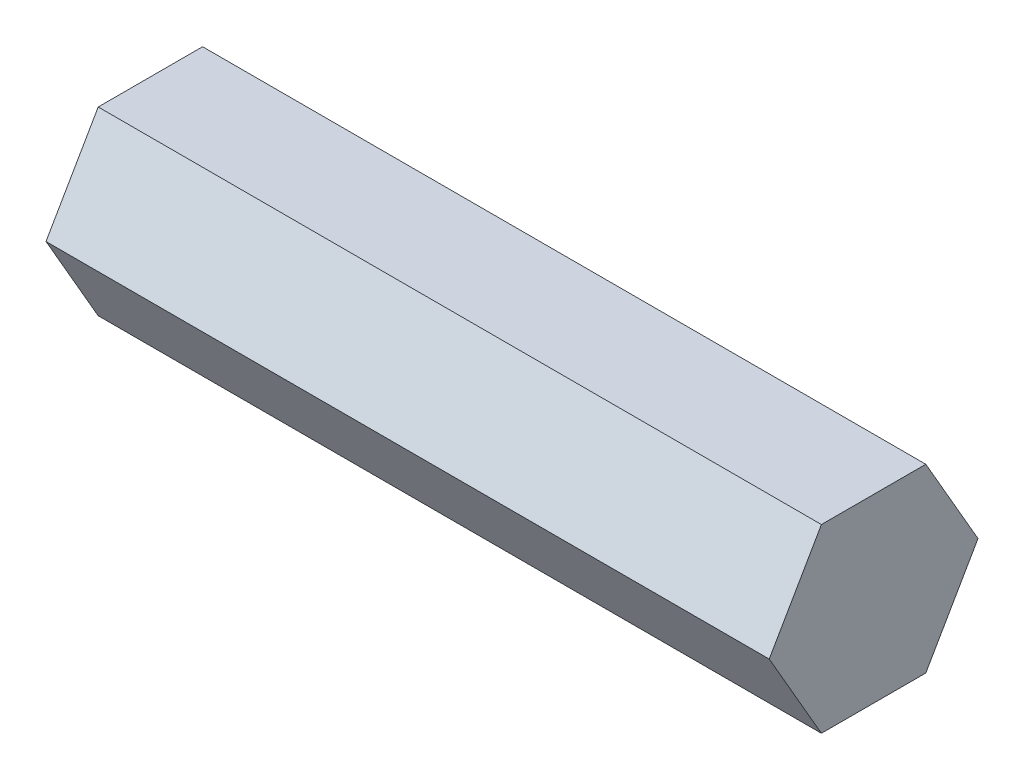
ISO-10303-21;
HEADER;
FILE_DESCRIPTION(('STEP AP214'),'2;1');
FILE_NAME('part.step','',(''),(''),'','','');
FILE_SCHEMA(('AUTOMOTIVE_DESIGN { 1 0 10303 214 1 1 1 1 }'));
ENDSEC;
DATA;
#1=APPLICATION_CONTEXT('core data for automotive mechanical design processes');
#2=APPLICATION_PROTOCOL_DEFINITION('international standard','automotive_design',2000,#1);
#3=PRODUCT_CONTEXT('',#1,'mechanical');
#4=PRODUCT('Part','Part','',(#3));
#5=PRODUCT_RELATED_PRODUCT_CATEGORY('part','',(#4));
#6=PRODUCT_DEFINITION_FORMATION('','',#4);
#7=PRODUCT_DEFINITION_CONTEXT('part definition',#1,'design');
#8=PRODUCT_DEFINITION('design','',#6,#7);
#9=PRODUCT_DEFINITION_SHAPE('','',#8);
#10=(LENGTH_UNIT() NAMED_UNIT(*) SI_UNIT(.MILLI.,.METRE.));
#11=(NAMED_UNIT(*) PLANE_ANGLE_UNIT() SI_UNIT($,.RADIAN.));
#12=(NAMED_UNIT(*) SI_UNIT($,.STERADIAN.) SOLID_ANGLE_UNIT());
#13=UNCERTAINTY_MEASURE_WITH_UNIT(LENGTH_MEASURE(1.E-05),#10,'distance_accuracy_value','');
#14=(GEOMETRIC_REPRESENTATION_CONTEXT(3) GLOBAL_UNCERTAINTY_ASSIGNED_CONTEXT((#13)) GLOBAL_UNIT_ASSIGNED_CONTEXT((#10,
#11,#12)) REPRESENTATION_CONTEXT('',''));
#15=CARTESIAN_POINT('',(0.,0.,0.));
#16=DIRECTION('',(0.,0.,1.));
#17=DIRECTION('',(1.,0.,0.));
#18=AXIS2_PLACEMENT_3D('',#15,#16,#17);
#19=CARTESIAN_POINT('',(25.4,-6.34999999999996,-3.6661742093542));
#20=DIRECTION('',(0.,0.499999999999995,0.866025403784441));
#21=DIRECTION('',(0.,-0.866025403784441,0.499999999999995));
#22=AXIS2_PLACEMENT_3D('',#19,#20,#21);
#23=PLANE('',#22);
#24=DIRECTION('',(0.,0.866025403784441,-0.499999999999995));
#25=VECTOR('',#24,1.);
#26=CARTESIAN_POINT('',(-25.4,-6.34999999999996,-3.6661742093542));
#27=LINE('',#26,#25);
#28=CARTESIAN_POINT('',(-25.4,-6.34999999999996,-3.6661742093542));
#29=VERTEX_POINT('',#28);
#30=CARTESIAN_POINT('',(-25.4,0.,-7.33234841870825));
#31=VERTEX_POINT('',#30);
#32=EDGE_CURVE('E153',#29,#31,#27,.T.);
#33=ORIENTED_EDGE('',*,*,#32,.T.);
#34=DIRECTION('',(-1.,0.,0.));
#35=VECTOR('',#34,1.);
#36=CARTESIAN_POINT('',(25.4,0.,-7.33234841870825));
#37=LINE('',#36,#35);
#38=CARTESIAN_POINT('',(25.4,0.,-7.33234841870825));
#39=VERTEX_POINT('',#38);
#40=EDGE_CURVE('E11',#39,#31,#37,.T.);
#41=ORIENTED_EDGE('',*,*,#40,.F.);
#42=DIRECTION('',(0.,0.866025403784441,-0.499999999999995));
#43=VECTOR('',#42,1.);
#44=CARTESIAN_POINT('',(25.4,-6.34999999999996,-3.6661742093542));
#45=LINE('',#44,#43);
#46=CARTESIAN_POINT('',(25.4,-6.34999999999996,-3.6661742093542));
#47=VERTEX_POINT('',#46);
#48=EDGE_CURVE('E171',#47,#39,#45,.T.);
#49=ORIENTED_EDGE('',*,*,#48,.F.);
#50=DIRECTION('',(-1.,0.,0.));
#51=VECTOR('',#50,1.);
#52=CARTESIAN_POINT('',(25.4,-6.34999999999996,-3.6661742093542));
#53=LINE('',#52,#51);
#54=EDGE_CURVE('E149',#47,#29,#53,.T.);
#55=ORIENTED_EDGE('',*,*,#54,.T.);
#56=EDGE_LOOP('',(#33,#41,#49,#55));
#57=FACE_BOUND('',#56,.T.);
#58=ADVANCED_FACE('F49',(#57),#23,.F.);
#59=CARTESIAN_POINT('',(25.4,0.,-7.33234841870825));
#60=DIRECTION('',(0.,-0.500000000000001,0.866025403784438));
#61=DIRECTION('',(0.,-0.866025403784438,-0.500000000000001));
#62=AXIS2_PLACEMENT_3D('',#59,#60,#61);
#63=PLANE('',#62);
#64=DIRECTION('',(0.,0.866025403784438,0.500000000000001));
#65=VECTOR('',#64,1.);
#66=CARTESIAN_POINT('',(-25.4,0.,-7.33234841870825));
#67=LINE('',#66,#65);
#68=CARTESIAN_POINT('',(-25.4,6.35000000000001,-3.66617420935411));
#69=VERTEX_POINT('',#68);
#70=EDGE_CURVE('E157',#31,#69,#67,.T.);
#71=ORIENTED_EDGE('',*,*,#70,.T.);
#72=DIRECTION('',(-1.,0.,0.));
#73=VECTOR('',#72,1.);
#74=CARTESIAN_POINT('',(25.4,6.35000000000001,-3.66617420935411));
#75=LINE('',#74,#73);
#76=CARTESIAN_POINT('',(25.4,6.35000000000001,-3.66617420935411));
#77=VERTEX_POINT('',#76);
#78=EDGE_CURVE('E57',#77,#69,#75,.T.);
#79=ORIENTED_EDGE('',*,*,#78,.F.);
#80=DIRECTION('',(0.,0.866025403784438,0.500000000000001));
#81=VECTOR('',#80,1.);
#82=CARTESIAN_POINT('',(25.4,0.,-7.33234841870825));
#83=LINE('',#82,#81);
#84=EDGE_CURVE('E108',#39,#77,#83,.T.);
#85=ORIENTED_EDGE('',*,*,#84,.F.);
#86=ORIENTED_EDGE('',*,*,#40,.T.);
#87=EDGE_LOOP('',(#71,#79,#85,#86));
#88=FACE_BOUND('',#87,.T.);
#89=ADVANCED_FACE('F341',(#88),#63,.F.);
#90=CARTESIAN_POINT('',(25.4,6.35000000000001,-3.66617420935411));
#91=DIRECTION('',(0.,-1.,0.));
#92=DIRECTION('',(0.,0.,-1.));
#93=AXIS2_PLACEMENT_3D('',#90,#91,#92);
#94=PLANE('',#93);
#95=DIRECTION('',(0.,0.,1.));
#96=VECTOR('',#95,1.);
#97=CARTESIAN_POINT('',(-25.4,6.35000000000001,-3.66617420935411));
#98=LINE('',#97,#96);
#99=CARTESIAN_POINT('',(-25.4,6.34999999999999,3.66617420935416));
#100=VERTEX_POINT('',#99);
#101=EDGE_CURVE('E161',#69,#100,#98,.T.);
#102=ORIENTED_EDGE('',*,*,#101,.T.);
#103=DIRECTION('',(-1.,0.,0.));
#104=VECTOR('',#103,1.);
#105=CARTESIAN_POINT('',(25.4,6.34999999999999,3.66617420935416));
#106=LINE('',#105,#104);
#107=CARTESIAN_POINT('',(25.4,6.34999999999999,3.66617420935416));
#108=VERTEX_POINT('',#107);
#109=EDGE_CURVE('E139',#108,#100,#106,.T.);
#110=ORIENTED_EDGE('',*,*,#109,.F.);
#111=DIRECTION('',(0.,0.,1.));
#112=VECTOR('',#111,1.);
#113=CARTESIAN_POINT('',(25.4,6.35000000000001,-3.66617420935411));
#114=LINE('',#113,#112);
#115=EDGE_CURVE('E125',#77,#108,#114,.T.);
#116=ORIENTED_EDGE('',*,*,#115,.F.);
#117=ORIENTED_EDGE('',*,*,#78,.T.);
#118=EDGE_LOOP('',(#102,#110,#116,#117));
#119=FACE_BOUND('',#118,.T.);
#120=ADVANCED_FACE('F183',(#119),#94,.F.);
#121=CARTESIAN_POINT('',(25.4,6.34999999999999,3.66617420935416));
#122=DIRECTION('',(0.,-0.499999999999995,-0.866025403784442));
#123=DIRECTION('',(0.,0.866025403784442,-0.499999999999995));
#124=AXIS2_PLACEMENT_3D('',#121,#122,#123);
#125=PLANE('',#124);
#126=DIRECTION('',(0.,-0.866025403784442,0.499999999999995));
#127=VECTOR('',#126,1.);
#128=CARTESIAN_POINT('',(-25.4,6.34999999999999,3.66617420935416));
#129=LINE('',#128,#127);
#130=CARTESIAN_POINT('',(-25.4,0.,7.33234841870825));
#131=VERTEX_POINT('',#130);
#132=EDGE_CURVE('E135',#100,#131,#129,.T.);
#133=ORIENTED_EDGE('',*,*,#132,.T.);
#134=DIRECTION('',(-1.,0.,0.));
#135=VECTOR('',#134,1.);
#136=CARTESIAN_POINT('',(25.4,0.,7.33234841870825));
#137=LINE('',#136,#135);
#138=CARTESIAN_POINT('',(25.4,0.,7.33234841870825));
#139=VERTEX_POINT('',#138);
#140=EDGE_CURVE('E132',#139,#131,#137,.T.);
#141=ORIENTED_EDGE('',*,*,#140,.F.);
#142=DIRECTION('',(0.,-0.866025403784442,0.499999999999995));
#143=VECTOR('',#142,1.);
#144=CARTESIAN_POINT('',(25.4,6.34999999999999,3.66617420935416));
#145=LINE('',#144,#143);
#146=EDGE_CURVE('E118',#108,#139,#145,.T.);
#147=ORIENTED_EDGE('',*,*,#146,.F.);
#148=ORIENTED_EDGE('',*,*,#109,.T.);
#149=EDGE_LOOP('',(#133,#141,#147,#148));
#150=FACE_BOUND('',#149,.T.);
#151=ADVANCED_FACE('F133',(#150),#125,.F.);
#152=CARTESIAN_POINT('',(25.4,0.,7.33234841870825));
#153=DIRECTION('',(0.,0.500000000000007,-0.866025403784435));
#154=DIRECTION('',(0.,0.866025403784435,0.500000000000007));
#155=AXIS2_PLACEMENT_3D('',#152,#153,#154);
#156=PLANE('',#155);
#157=DIRECTION('',(0.,-0.866025403784435,-0.500000000000007));
#158=VECTOR('',#157,1.);
#159=CARTESIAN_POINT('',(-25.4,0.,7.33234841870825));
#160=LINE('',#159,#158);
#161=CARTESIAN_POINT('',(-25.4,-6.35000000000004,3.66617420935407));
#162=VERTEX_POINT('',#161);
#163=EDGE_CURVE('E166',#131,#162,#160,.T.);
#164=ORIENTED_EDGE('',*,*,#163,.T.);
#165=DIRECTION('',(-1.,0.,0.));
#166=VECTOR('',#165,1.);
#167=CARTESIAN_POINT('',(25.4,-6.35000000000004,3.66617420935407));
#168=LINE('',#167,#166);
#169=CARTESIAN_POINT('',(25.4,-6.35000000000004,3.66617420935407));
#170=VERTEX_POINT('',#169);
#171=EDGE_CURVE('E140',#170,#162,#168,.T.);
#172=ORIENTED_EDGE('',*,*,#171,.F.);
#173=DIRECTION('',(0.,-0.866025403784435,-0.500000000000007));
#174=VECTOR('',#173,1.);
#175=CARTESIAN_POINT('',(25.4,0.,7.33234841870825));
#176=LINE('',#175,#174);
#177=EDGE_CURVE('E122',#139,#170,#176,.T.);
#178=ORIENTED_EDGE('',*,*,#177,.F.);
#179=ORIENTED_EDGE('',*,*,#140,.T.);
#180=EDGE_LOOP('',(#164,#172,#178,#179));
#181=FACE_BOUND('',#180,.T.);
#182=ADVANCED_FACE('F142',(#181),#156,.F.);
#183=CARTESIAN_POINT('',(25.4,-6.35000000000004,3.66617420935407));
#184=DIRECTION('',(0.,1.,0.));
#185=DIRECTION('',(0.,0.,1.));
#186=AXIS2_PLACEMENT_3D('',#183,#184,#185);
#187=PLANE('',#186);
#188=DIRECTION('',(0.,0.,-1.));
#189=VECTOR('',#188,1.);
#190=CARTESIAN_POINT('',(-25.4,-6.35000000000004,3.66617420935407));
#191=LINE('',#190,#189);
#192=EDGE_CURVE('E100',#162,#29,#191,.T.);
#193=ORIENTED_EDGE('',*,*,#192,.T.);
#194=ORIENTED_EDGE('',*,*,#54,.F.);
#195=DIRECTION('',(0.,0.,-1.));
#196=VECTOR('',#195,1.);
#197=CARTESIAN_POINT('',(25.4,-6.35000000000004,3.66617420935407));
#198=LINE('',#197,#196);
#199=EDGE_CURVE('E73',#170,#47,#198,.T.);
#200=ORIENTED_EDGE('',*,*,#199,.F.);
#201=ORIENTED_EDGE('',*,*,#171,.T.);
#202=EDGE_LOOP('',(#193,#194,#200,#201));
#203=FACE_BOUND('',#202,.T.);
#204=ADVANCED_FACE('F187',(#203),#187,.F.);
#205=CARTESIAN_POINT('',(25.4,0.,0.));
#206=DIRECTION('',(1.,0.,0.));
#207=DIRECTION('',(0.,0.,-1.));
#208=AXIS2_PLACEMENT_3D('',#205,#206,#207);
#209=PLANE('',#208);
#210=ORIENTED_EDGE('',*,*,#48,.T.);
#211=ORIENTED_EDGE('',*,*,#84,.T.);
#212=ORIENTED_EDGE('',*,*,#115,.T.);
#213=ORIENTED_EDGE('',*,*,#146,.T.);
#214=ORIENTED_EDGE('',*,*,#177,.T.);
#215=ORIENTED_EDGE('',*,*,#199,.T.);
#216=EDGE_LOOP('',(#210,#211,#212,#213,#214,#215));
#217=FACE_BOUND('',#216,.T.);
#218=ADVANCED_FACE('F120',(#217),#209,.T.);
#219=CARTESIAN_POINT('',(-25.4,0.,0.));
#220=DIRECTION('',(1.,0.,0.));
#221=DIRECTION('',(0.,0.,-1.));
#222=AXIS2_PLACEMENT_3D('',#219,#220,#221);
#223=PLANE('',#222);
#224=DIRECTION('',(0.,0.866025403784438,-0.5));
#225=VECTOR('',#224,1.);
#226=CARTESIAN_POINT('',(-25.4,0.,3.46410157934204));
#227=LINE('',#226,#225);
#228=CARTESIAN_POINT('',(-25.4,0.,3.46410157934204));
#229=VERTEX_POINT('',#228);
#230=CARTESIAN_POINT('',(-25.4,2.999999969,1.73205078967102));
#231=VERTEX_POINT('',#230);
#232=EDGE_CURVE('E224',#229,#231,#227,.T.);
#233=ORIENTED_EDGE('',*,*,#232,.F.);
#234=DIRECTION('',(0.,0.866025403784439,0.5));
#235=VECTOR('',#234,1.);
#236=CARTESIAN_POINT('',(-25.4,-2.999999969,1.73205078967102));
#237=LINE('',#236,#235);
#238=CARTESIAN_POINT('',(-25.4,-2.999999969,1.73205078967102));
#239=VERTEX_POINT('',#238);
#240=EDGE_CURVE('E64',#239,#229,#237,.T.);
#241=ORIENTED_EDGE('',*,*,#240,.F.);
#242=DIRECTION('',(0.,0.,1.));
#243=VECTOR('',#242,1.);
#244=CARTESIAN_POINT('',(-25.4,-2.999999969,-1.73205078967102));
#245=LINE('',#244,#243);
#246=CARTESIAN_POINT('',(-25.4,-2.999999969,-1.73205078967102));
#247=VERTEX_POINT('',#246);
#248=EDGE_CURVE('E257',#247,#239,#245,.T.);
#249=ORIENTED_EDGE('',*,*,#248,.F.);
#250=DIRECTION('',(0.,-0.866025403784438,0.5));
#251=VECTOR('',#250,1.);
#252=CARTESIAN_POINT('',(-25.4,0.,-3.46410157934204));
#253=LINE('',#252,#251);
#254=CARTESIAN_POINT('',(-25.4,0.,-3.46410157934204));
#255=VERTEX_POINT('',#254);
#256=EDGE_CURVE('E262',#255,#247,#253,.T.);
#257=ORIENTED_EDGE('',*,*,#256,.F.);
#258=DIRECTION('',(0.,-0.866025403784439,-0.5));
#259=VECTOR('',#258,1.);
#260=CARTESIAN_POINT('',(-25.4,2.999999969,-1.73205078967102));
#261=LINE('',#260,#259);
#262=CARTESIAN_POINT('',(-25.4,2.999999969,-1.73205078967102));
#263=VERTEX_POINT('',#262);
#264=EDGE_CURVE('E269',#263,#255,#261,.T.);
#265=ORIENTED_EDGE('',*,*,#264,.F.);
#266=DIRECTION('',(0.,0.,-1.));
#267=VECTOR('',#266,1.);
#268=CARTESIAN_POINT('',(-25.4,2.999999969,1.73205078967102));
#269=LINE('',#268,#267);
#270=EDGE_CURVE('E227',#231,#263,#269,.T.);
#271=ORIENTED_EDGE('',*,*,#270,.F.);
#272=EDGE_LOOP('',(#233,#241,#249,#257,#265,#271));
#273=FACE_BOUND('',#272,.T.);
#274=ORIENTED_EDGE('',*,*,#32,.F.);
#275=ORIENTED_EDGE('',*,*,#192,.F.);
#276=ORIENTED_EDGE('',*,*,#163,.F.);
#277=ORIENTED_EDGE('',*,*,#132,.F.);
#278=ORIENTED_EDGE('',*,*,#101,.F.);
#279=ORIENTED_EDGE('',*,*,#70,.F.);
#280=EDGE_LOOP('',(#274,#275,#276,#277,#278,#279));
#281=FACE_BOUND('',#280,.T.);
#282=ADVANCED_FACE('F186',(#273,#281),#223,.F.);
#283=CARTESIAN_POINT('',(-12.7,-2.999999969,1.73205078967102));
#284=DIRECTION('',(0.,-0.5,0.866025403784439));
#285=DIRECTION('',(0.,-0.866025403784439,-0.5));
#286=AXIS2_PLACEMENT_3D('',#283,#284,#285);
#287=PLANE('',#286);
#288=ORIENTED_EDGE('',*,*,#240,.T.);
#289=DIRECTION('',(-1.,0.,0.));
#290=VECTOR('',#289,1.);
#291=CARTESIAN_POINT('',(-12.7,0.,3.46410157934204));
#292=LINE('',#291,#290);
#293=CARTESIAN_POINT('',(-12.7,0.,3.46410157934204));
#294=VERTEX_POINT('',#293);
#295=EDGE_CURVE('E199',#294,#229,#292,.T.);
#296=ORIENTED_EDGE('',*,*,#295,.F.);
#297=DIRECTION('',(0.,0.866025403784439,0.5));
#298=VECTOR('',#297,1.);
#299=CARTESIAN_POINT('',(-12.7,-2.999999969,1.73205078967102));
#300=LINE('',#299,#298);
#301=CARTESIAN_POINT('',(-12.7,-2.999999969,1.73205078967102));
#302=VERTEX_POINT('',#301);
#303=EDGE_CURVE('E252',#302,#294,#300,.T.);
#304=ORIENTED_EDGE('',*,*,#303,.F.);
#305=DIRECTION('',(-1.,0.,0.));
#306=VECTOR('',#305,1.);
#307=CARTESIAN_POINT('',(-12.7,-2.999999969,1.73205078967102));
#308=LINE('',#307,#306);
#309=EDGE_CURVE('E158',#302,#239,#308,.T.);
#310=ORIENTED_EDGE('',*,*,#309,.T.);
#311=EDGE_LOOP('',(#288,#296,#304,#310));
#312=FACE_BOUND('',#311,.T.);
#313=ADVANCED_FACE('F328',(#312),#287,.F.);
#314=CARTESIAN_POINT('',(-12.7,-2.999999969,-1.73205078967102));
#315=DIRECTION('',(0.,-1.,0.));
#316=DIRECTION('',(0.,0.,-1.));
#317=AXIS2_PLACEMENT_3D('',#314,#315,#316);
#318=PLANE('',#317);
#319=ORIENTED_EDGE('',*,*,#248,.T.);
#320=ORIENTED_EDGE('',*,*,#309,.F.);
#321=DIRECTION('',(0.,0.,1.));
#322=VECTOR('',#321,1.);
#323=CARTESIAN_POINT('',(-12.7,-2.999999969,-1.73205078967102));
#324=LINE('',#323,#322);
#325=CARTESIAN_POINT('',(-12.7,-2.999999969,-1.73205078967102));
#326=VERTEX_POINT('',#325);
#327=EDGE_CURVE('E208',#326,#302,#324,.T.);
#328=ORIENTED_EDGE('',*,*,#327,.F.);
#329=DIRECTION('',(-1.,0.,0.));
#330=VECTOR('',#329,1.);
#331=CARTESIAN_POINT('',(-12.7,-2.999999969,-1.73205078967102));
#332=LINE('',#331,#330);
#333=EDGE_CURVE('E218',#326,#247,#332,.T.);
#334=ORIENTED_EDGE('',*,*,#333,.T.);
#335=EDGE_LOOP('',(#319,#320,#328,#334));
#336=FACE_BOUND('',#335,.T.);
#337=ADVANCED_FACE('F331',(#336),#318,.F.);
#338=CARTESIAN_POINT('',(-12.7,0.,-3.46410157934204));
#339=DIRECTION('',(0.,-0.5,-0.866025403784438));
#340=DIRECTION('',(0.,0.866025403784439,-0.5));
#341=AXIS2_PLACEMENT_3D('',#338,#339,#340);
#342=PLANE('',#341);
#343=ORIENTED_EDGE('',*,*,#256,.T.);
#344=ORIENTED_EDGE('',*,*,#333,.F.);
#345=DIRECTION('',(0.,-0.866025403784438,0.5));
#346=VECTOR('',#345,1.);
#347=CARTESIAN_POINT('',(-12.7,0.,-3.46410157934204));
#348=LINE('',#347,#346);
#349=CARTESIAN_POINT('',(-12.7,0.,-3.46410157934204));
#350=VERTEX_POINT('',#349);
#351=EDGE_CURVE('E232',#350,#326,#348,.T.);
#352=ORIENTED_EDGE('',*,*,#351,.F.);
#353=DIRECTION('',(-1.,0.,0.));
#354=VECTOR('',#353,1.);
#355=CARTESIAN_POINT('',(-12.7,0.,-3.46410157934204));
#356=LINE('',#355,#354);
#357=EDGE_CURVE('E215',#350,#255,#356,.T.);
#358=ORIENTED_EDGE('',*,*,#357,.T.);
#359=EDGE_LOOP('',(#343,#344,#352,#358));
#360=FACE_BOUND('',#359,.T.);
#361=ADVANCED_FACE('F332',(#360),#342,.F.);
#362=CARTESIAN_POINT('',(-12.7,2.999999969,-1.73205078967102));
#363=DIRECTION('',(0.,0.5,-0.866025403784439));
#364=DIRECTION('',(0.,0.866025403784439,0.5));
#365=AXIS2_PLACEMENT_3D('',#362,#363,#364);
#366=PLANE('',#365);
#367=ORIENTED_EDGE('',*,*,#264,.T.);
#368=ORIENTED_EDGE('',*,*,#357,.F.);
#369=DIRECTION('',(0.,-0.866025403784439,-0.5));
#370=VECTOR('',#369,1.);
#371=CARTESIAN_POINT('',(-12.7,2.999999969,-1.73205078967102));
#372=LINE('',#371,#370);
#373=CARTESIAN_POINT('',(-12.7,2.999999969,-1.73205078967102));
#374=VERTEX_POINT('',#373);
#375=EDGE_CURVE('E237',#374,#350,#372,.T.);
#376=ORIENTED_EDGE('',*,*,#375,.F.);
#377=DIRECTION('',(-1.,0.,0.));
#378=VECTOR('',#377,1.);
#379=CARTESIAN_POINT('',(-12.7,2.999999969,-1.73205078967102));
#380=LINE('',#379,#378);
#381=EDGE_CURVE('E219',#374,#263,#380,.T.);
#382=ORIENTED_EDGE('',*,*,#381,.T.);
#383=EDGE_LOOP('',(#367,#368,#376,#382));
#384=FACE_BOUND('',#383,.T.);
#385=ADVANCED_FACE('F309',(#384),#366,.F.);
#386=CARTESIAN_POINT('',(-12.7,2.999999969,1.73205078967102));
#387=DIRECTION('',(0.,1.,0.));
#388=DIRECTION('',(0.,0.,1.));
#389=AXIS2_PLACEMENT_3D('',#386,#387,#388);
#390=PLANE('',#389);
#391=ORIENTED_EDGE('',*,*,#270,.T.);
#392=ORIENTED_EDGE('',*,*,#381,.F.);
#393=DIRECTION('',(0.,0.,-1.));
#394=VECTOR('',#393,1.);
#395=CARTESIAN_POINT('',(-12.7,2.999999969,1.73205078967102));
#396=LINE('',#395,#394);
#397=CARTESIAN_POINT('',(-12.7,2.999999969,1.73205078967102));
#398=VERTEX_POINT('',#397);
#399=EDGE_CURVE('E242',#398,#374,#396,.T.);
#400=ORIENTED_EDGE('',*,*,#399,.F.);
#401=DIRECTION('',(-1.,0.,0.));
#402=VECTOR('',#401,1.);
#403=CARTESIAN_POINT('',(-12.7,2.999999969,1.73205078967102));
#404=LINE('',#403,#402);
#405=EDGE_CURVE('E207',#398,#231,#404,.T.);
#406=ORIENTED_EDGE('',*,*,#405,.T.);
#407=EDGE_LOOP('',(#391,#392,#400,#406));
#408=FACE_BOUND('',#407,.T.);
#409=ADVANCED_FACE('F291',(#408),#390,.F.);
#410=CARTESIAN_POINT('',(-12.7,0.,3.46410157934204));
#411=DIRECTION('',(0.,0.5,0.866025403784438));
#412=DIRECTION('',(0.,-0.866025403784439,0.5));
#413=AXIS2_PLACEMENT_3D('',#410,#411,#412);
#414=PLANE('',#413);
#415=ORIENTED_EDGE('',*,*,#232,.T.);
#416=ORIENTED_EDGE('',*,*,#405,.F.);
#417=DIRECTION('',(0.,0.866025403784438,-0.5));
#418=VECTOR('',#417,1.);
#419=CARTESIAN_POINT('',(-12.7,0.,3.46410157934204));
#420=LINE('',#419,#418);
#421=EDGE_CURVE('E248',#294,#398,#420,.T.);
#422=ORIENTED_EDGE('',*,*,#421,.F.);
#423=ORIENTED_EDGE('',*,*,#295,.T.);
#424=EDGE_LOOP('',(#415,#416,#422,#423));
#425=FACE_BOUND('',#424,.T.);
#426=ADVANCED_FACE('F301',(#425),#414,.F.);
#427=CARTESIAN_POINT('',(-12.7,0.,0.));
#428=DIRECTION('',(-1.,0.,0.));
#429=DIRECTION('',(0.,0.,1.));
#430=AXIS2_PLACEMENT_3D('',#427,#428,#429);
#431=PLANE('',#430);
#432=ORIENTED_EDGE('',*,*,#303,.T.);
#433=ORIENTED_EDGE('',*,*,#421,.T.);
#434=ORIENTED_EDGE('',*,*,#399,.T.);
#435=ORIENTED_EDGE('',*,*,#375,.T.);
#436=ORIENTED_EDGE('',*,*,#351,.T.);
#437=ORIENTED_EDGE('',*,*,#327,.T.);
#438=EDGE_LOOP('',(#432,#433,#434,#435,#436,#437));
#439=FACE_BOUND('',#438,.T.);
#440=ADVANCED_FACE('F362',(#439),#431,.T.);
#441=CLOSED_SHELL('',(#58,#89,#120,#151,#182,#204,#218,#282,#313,#337,#361,#385,#409,#426,#440));
#442=MANIFOLD_SOLID_BREP('B2',#441);
#443=ADVANCED_BREP_SHAPE_REPRESENTATION('',(#18,#442),#14);
#444=SHAPE_DEFINITION_REPRESENTATION(#9,#443);
ENDSEC;
END-ISO-10303-21;
